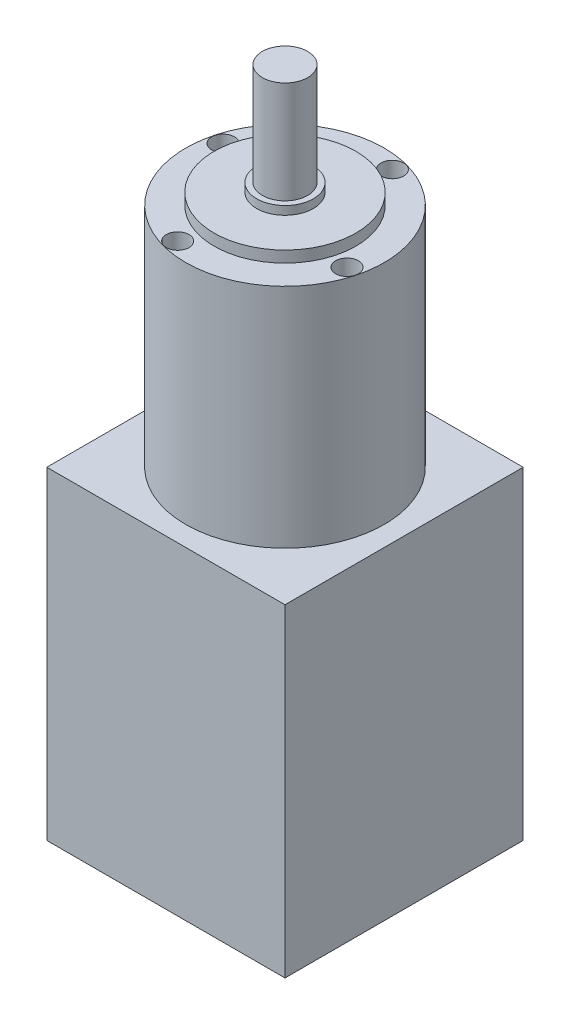
ISO-10303-21;
HEADER;
FILE_DESCRIPTION(('STEP AP214'),'2;1');
FILE_NAME('part.step','',(''),(''),'','','');
FILE_SCHEMA(('AUTOMOTIVE_DESIGN { 1 0 10303 214 1 1 1 1 }'));
ENDSEC;
DATA;
#1=APPLICATION_CONTEXT('core data for automotive mechanical design processes');
#2=APPLICATION_PROTOCOL_DEFINITION('international standard','automotive_design',2000,#1);
#3=PRODUCT_CONTEXT('',#1,'mechanical');
#4=PRODUCT('Part','Part','',(#3));
#5=PRODUCT_RELATED_PRODUCT_CATEGORY('part','',(#4));
#6=PRODUCT_DEFINITION_FORMATION('','',#4);
#7=PRODUCT_DEFINITION_CONTEXT('part definition',#1,'design');
#8=PRODUCT_DEFINITION('design','',#6,#7);
#9=PRODUCT_DEFINITION_SHAPE('','',#8);
#10=(LENGTH_UNIT() NAMED_UNIT(*) SI_UNIT(.MILLI.,.METRE.));
#11=(NAMED_UNIT(*) PLANE_ANGLE_UNIT() SI_UNIT($,.RADIAN.));
#12=(NAMED_UNIT(*) SI_UNIT($,.STERADIAN.) SOLID_ANGLE_UNIT());
#13=UNCERTAINTY_MEASURE_WITH_UNIT(LENGTH_MEASURE(1.E-05),#10,'distance_accuracy_value','');
#14=(GEOMETRIC_REPRESENTATION_CONTEXT(3) GLOBAL_UNCERTAINTY_ASSIGNED_CONTEXT((#13)) GLOBAL_UNIT_ASSIGNED_CONTEXT((#10,
#11,#12)) REPRESENTATION_CONTEXT('',''));
#15=CARTESIAN_POINT('',(0.,0.,0.));
#16=DIRECTION('',(0.,0.,1.));
#17=DIRECTION('',(1.,0.,0.));
#18=AXIS2_PLACEMENT_3D('',#15,#16,#17);
#19=CARTESIAN_POINT('',(21.,57.,21.));
#20=DIRECTION('',(-1.,0.,0.));
#21=DIRECTION('',(0.,0.,1.));
#22=AXIS2_PLACEMENT_3D('',#19,#20,#21);
#23=PLANE('',#22);
#24=DIRECTION('',(0.,0.,-1.));
#25=VECTOR('',#24,1.);
#26=CARTESIAN_POINT('',(21.,0.,21.));
#27=LINE('',#26,#25);
#28=CARTESIAN_POINT('',(21.,0.,21.));
#29=VERTEX_POINT('',#28);
#30=CARTESIAN_POINT('',(21.,0.,-21.));
#31=VERTEX_POINT('',#30);
#32=EDGE_CURVE('E98',#29,#31,#27,.T.);
#33=ORIENTED_EDGE('',*,*,#32,.T.);
#34=DIRECTION('',(0.,-1.,0.));
#35=VECTOR('',#34,1.);
#36=CARTESIAN_POINT('',(21.,57.,-21.));
#37=LINE('',#36,#35);
#38=CARTESIAN_POINT('',(21.,57.,-21.));
#39=VERTEX_POINT('',#38);
#40=EDGE_CURVE('E11',#39,#31,#37,.T.);
#41=ORIENTED_EDGE('',*,*,#40,.F.);
#42=DIRECTION('',(0.,0.,-1.));
#43=VECTOR('',#42,1.);
#44=CARTESIAN_POINT('',(21.,57.,21.));
#45=LINE('',#44,#43);
#46=CARTESIAN_POINT('',(21.,57.,21.));
#47=VERTEX_POINT('',#46);
#48=EDGE_CURVE('E86',#47,#39,#45,.T.);
#49=ORIENTED_EDGE('',*,*,#48,.F.);
#50=DIRECTION('',(0.,-1.,0.));
#51=VECTOR('',#50,1.);
#52=CARTESIAN_POINT('',(21.,57.,21.));
#53=LINE('',#52,#51);
#54=EDGE_CURVE('E94',#47,#29,#53,.T.);
#55=ORIENTED_EDGE('',*,*,#54,.T.);
#56=EDGE_LOOP('',(#33,#41,#49,#55));
#57=FACE_BOUND('',#56,.T.);
#58=ADVANCED_FACE('F35',(#57),#23,.F.);
#59=CARTESIAN_POINT('',(-21.,57.,-21.));
#60=DIRECTION('',(0.,0.,1.));
#61=DIRECTION('',(1.,0.,0.));
#62=AXIS2_PLACEMENT_3D('',#59,#60,#61);
#63=PLANE('',#62);
#64=DIRECTION('',(-1.,0.,0.));
#65=VECTOR('',#64,1.);
#66=CARTESIAN_POINT('',(-21.,0.,-21.));
#67=LINE('',#66,#65);
#68=CARTESIAN_POINT('',(-21.,0.,-21.));
#69=VERTEX_POINT('',#68);
#70=EDGE_CURVE('E90',#31,#69,#67,.T.);
#71=ORIENTED_EDGE('',*,*,#70,.T.);
#72=DIRECTION('',(0.,-1.,0.));
#73=VECTOR('',#72,1.);
#74=CARTESIAN_POINT('',(-21.,57.,-21.));
#75=LINE('',#74,#73);
#76=CARTESIAN_POINT('',(-21.,57.,-21.));
#77=VERTEX_POINT('',#76);
#78=EDGE_CURVE('E43',#77,#69,#75,.T.);
#79=ORIENTED_EDGE('',*,*,#78,.F.);
#80=DIRECTION('',(-1.,0.,0.));
#81=VECTOR('',#80,1.);
#82=CARTESIAN_POINT('',(-21.,57.,-21.));
#83=LINE('',#82,#81);
#84=EDGE_CURVE('E81',#39,#77,#83,.T.);
#85=ORIENTED_EDGE('',*,*,#84,.F.);
#86=ORIENTED_EDGE('',*,*,#40,.T.);
#87=EDGE_LOOP('',(#71,#79,#85,#86));
#88=FACE_BOUND('',#87,.T.);
#89=ADVANCED_FACE('F89',(#88),#63,.F.);
#90=CARTESIAN_POINT('',(-21.,57.,21.));
#91=DIRECTION('',(1.,0.,0.));
#92=DIRECTION('',(0.,0.,-1.));
#93=AXIS2_PLACEMENT_3D('',#90,#91,#92);
#94=PLANE('',#93);
#95=DIRECTION('',(0.,0.,1.));
#96=VECTOR('',#95,1.);
#97=CARTESIAN_POINT('',(-21.,0.,21.));
#98=LINE('',#97,#96);
#99=CARTESIAN_POINT('',(-21.,0.,21.));
#100=VERTEX_POINT('',#99);
#101=EDGE_CURVE('E68',#69,#100,#98,.T.);
#102=ORIENTED_EDGE('',*,*,#101,.T.);
#103=DIRECTION('',(0.,-1.,0.));
#104=VECTOR('',#103,1.);
#105=CARTESIAN_POINT('',(-21.,57.,21.));
#106=LINE('',#105,#104);
#107=CARTESIAN_POINT('',(-21.,57.,21.));
#108=VERTEX_POINT('',#107);
#109=EDGE_CURVE('E91',#108,#100,#106,.T.);
#110=ORIENTED_EDGE('',*,*,#109,.F.);
#111=DIRECTION('',(0.,0.,1.));
#112=VECTOR('',#111,1.);
#113=CARTESIAN_POINT('',(-21.,57.,21.));
#114=LINE('',#113,#112);
#115=EDGE_CURVE('E84',#77,#108,#114,.T.);
#116=ORIENTED_EDGE('',*,*,#115,.F.);
#117=ORIENTED_EDGE('',*,*,#78,.T.);
#118=EDGE_LOOP('',(#102,#110,#116,#117));
#119=FACE_BOUND('',#118,.T.);
#120=ADVANCED_FACE('F92',(#119),#94,.F.);
#121=CARTESIAN_POINT('',(-21.,57.,21.));
#122=DIRECTION('',(0.,0.,-1.));
#123=DIRECTION('',(-1.,0.,0.));
#124=AXIS2_PLACEMENT_3D('',#121,#122,#123);
#125=PLANE('',#124);
#126=DIRECTION('',(1.,0.,0.));
#127=VECTOR('',#126,1.);
#128=CARTESIAN_POINT('',(-21.,0.,21.));
#129=LINE('',#128,#127);
#130=EDGE_CURVE('E74',#100,#29,#129,.T.);
#131=ORIENTED_EDGE('',*,*,#130,.T.);
#132=ORIENTED_EDGE('',*,*,#54,.F.);
#133=DIRECTION('',(1.,0.,0.));
#134=VECTOR('',#133,1.);
#135=CARTESIAN_POINT('',(-21.,57.,21.));
#136=LINE('',#135,#134);
#137=EDGE_CURVE('E51',#108,#47,#136,.T.);
#138=ORIENTED_EDGE('',*,*,#137,.F.);
#139=ORIENTED_EDGE('',*,*,#109,.T.);
#140=EDGE_LOOP('',(#131,#132,#138,#139));
#141=FACE_BOUND('',#140,.T.);
#142=ADVANCED_FACE('F106',(#141),#125,.F.);
#143=CARTESIAN_POINT('',(0.,57.,0.));
#144=DIRECTION('',(0.,-1.,0.));
#145=DIRECTION('',(0.,0.,-1.));
#146=AXIS2_PLACEMENT_3D('',#143,#144,#145);
#147=PLANE('',#146);
#148=CARTESIAN_POINT('',(0.,57.,0.));
#149=DIRECTION('',(0.,-1.,0.));
#150=DIRECTION('',(0.,0.,-1.));
#151=AXIS2_PLACEMENT_3D('',#148,#149,#150);
#152=CIRCLE('',#151,17.5);
#153=CARTESIAN_POINT('',(0.,57.,-17.5));
#154=VERTEX_POINT('',#153);
#155=EDGE_CURVE('E112',#154,#154,#152,.T.);
#156=ORIENTED_EDGE('',*,*,#155,.T.);
#157=EDGE_LOOP('',(#156));
#158=FACE_BOUND('',#157,.T.);
#159=ORIENTED_EDGE('',*,*,#48,.T.);
#160=ORIENTED_EDGE('',*,*,#84,.T.);
#161=ORIENTED_EDGE('',*,*,#115,.T.);
#162=ORIENTED_EDGE('',*,*,#137,.T.);
#163=EDGE_LOOP('',(#159,#160,#161,#162));
#164=FACE_BOUND('',#163,.T.);
#165=ADVANCED_FACE('F82',(#158,#164),#147,.F.);
#166=CARTESIAN_POINT('',(0.,0.,0.));
#167=DIRECTION('',(0.,-1.,0.));
#168=DIRECTION('',(0.,0.,-1.));
#169=AXIS2_PLACEMENT_3D('',#166,#167,#168);
#170=PLANE('',#169);
#171=ORIENTED_EDGE('',*,*,#32,.F.);
#172=ORIENTED_EDGE('',*,*,#130,.F.);
#173=ORIENTED_EDGE('',*,*,#101,.F.);
#174=ORIENTED_EDGE('',*,*,#70,.F.);
#175=EDGE_LOOP('',(#171,#172,#173,#174));
#176=FACE_BOUND('',#175,.T.);
#177=ADVANCED_FACE('F109',(#176),#170,.T.);
#178=CARTESIAN_POINT('',(0.,97.,0.));
#179=DIRECTION('',(0.,-1.,0.));
#180=DIRECTION('',(0.,0.,-1.));
#181=AXIS2_PLACEMENT_3D('',#178,#179,#180);
#182=CYLINDRICAL_SURFACE('',#181,17.5);
#183=CARTESIAN_POINT('',(0.,97.,0.));
#184=DIRECTION('',(0.,-1.,0.));
#185=DIRECTION('',(0.,0.,-1.));
#186=AXIS2_PLACEMENT_3D('',#183,#184,#185);
#187=CIRCLE('',#186,17.5);
#188=CARTESIAN_POINT('',(0.,97.,-17.5));
#189=VERTEX_POINT('',#188);
#190=EDGE_CURVE('E101',#189,#189,#187,.T.);
#191=ORIENTED_EDGE('',*,*,#190,.T.);
#192=EDGE_LOOP('',(#191));
#193=FACE_BOUND('',#192,.T.);
#194=ORIENTED_EDGE('',*,*,#155,.F.);
#195=EDGE_LOOP('',(#194));
#196=FACE_BOUND('',#195,.T.);
#197=ADVANCED_FACE('F184',(#193,#196),#182,.T.);
#198=CARTESIAN_POINT('',(0.,97.,0.));
#199=DIRECTION('',(0.,-1.,0.));
#200=DIRECTION('',(0.,0.,-1.));
#201=AXIS2_PLACEMENT_3D('',#198,#199,#200);
#202=PLANE('',#201);
#203=CARTESIAN_POINT('',(3.99875424683385,97.,-14.9235540161661));
#204=DIRECTION('',(0.,-1.,0.));
#205=DIRECTION('',(0.,0.,-1.));
#206=AXIS2_PLACEMENT_3D('',#203,#204,#205);
#207=CIRCLE('',#206,2.);
#208=CARTESIAN_POINT('',(3.99875424683385,97.,-16.9235540161661));
#209=VERTEX_POINT('',#208);
#210=EDGE_CURVE('E154',#209,#209,#207,.T.);
#211=ORIENTED_EDGE('',*,*,#210,.T.);
#212=EDGE_LOOP('',(#211));
#213=FACE_BOUND('',#212,.T.);
#214=CARTESIAN_POINT('',(14.9235540161661,97.,3.99875424683386));
#215=DIRECTION('',(0.,-1.,0.));
#216=DIRECTION('',(0.,0.,-1.));
#217=AXIS2_PLACEMENT_3D('',#214,#215,#216);
#218=CIRCLE('',#217,2.00000000000001);
#219=CARTESIAN_POINT('',(14.9235540161661,97.,1.99875424683385));
#220=VERTEX_POINT('',#219);
#221=EDGE_CURVE('E148',#220,#220,#218,.T.);
#222=ORIENTED_EDGE('',*,*,#221,.T.);
#223=EDGE_LOOP('',(#222));
#224=FACE_BOUND('',#223,.T.);
#225=CARTESIAN_POINT('',(-3.99875424683385,97.,14.9235540161661));
#226=DIRECTION('',(0.,-1.,0.));
#227=DIRECTION('',(0.,0.,-1.));
#228=AXIS2_PLACEMENT_3D('',#225,#226,#227);
#229=CIRCLE('',#228,2.);
#230=CARTESIAN_POINT('',(-3.99875424683385,97.,12.9235540161661));
#231=VERTEX_POINT('',#230);
#232=EDGE_CURVE('E142',#231,#231,#229,.T.);
#233=ORIENTED_EDGE('',*,*,#232,.T.);
#234=EDGE_LOOP('',(#233));
#235=FACE_BOUND('',#234,.T.);
#236=CARTESIAN_POINT('',(-14.9235540161661,97.,-3.99875424683386));
#237=DIRECTION('',(0.,-1.,0.));
#238=DIRECTION('',(0.,0.,-1.));
#239=AXIS2_PLACEMENT_3D('',#236,#237,#238);
#240=CIRCLE('',#239,2.);
#241=CARTESIAN_POINT('',(-14.9235540161661,97.,-5.99875424683386));
#242=VERTEX_POINT('',#241);
#243=EDGE_CURVE('E136',#242,#242,#240,.T.);
#244=ORIENTED_EDGE('',*,*,#243,.T.);
#245=EDGE_LOOP('',(#244));
#246=FACE_BOUND('',#245,.T.);
#247=CARTESIAN_POINT('',(0.,97.,0.));
#248=DIRECTION('',(0.,-1.,0.));
#249=DIRECTION('',(0.,0.,-1.));
#250=AXIS2_PLACEMENT_3D('',#247,#248,#249);
#251=CIRCLE('',#250,12.5);
#252=CARTESIAN_POINT('',(0.,97.,-12.5));
#253=VERTEX_POINT('',#252);
#254=EDGE_CURVE('E118',#253,#253,#251,.T.);
#255=ORIENTED_EDGE('',*,*,#254,.T.);
#256=EDGE_LOOP('',(#255));
#257=FACE_BOUND('',#256,.T.);
#258=ORIENTED_EDGE('',*,*,#190,.F.);
#259=EDGE_LOOP('',(#258));
#260=FACE_BOUND('',#259,.T.);
#261=ADVANCED_FACE('F190',(#213,#224,#235,#246,#257,#260),#202,.F.);
#262=CARTESIAN_POINT('',(0.,99.,0.));
#263=DIRECTION('',(0.,-1.,0.));
#264=DIRECTION('',(0.,0.,-1.));
#265=AXIS2_PLACEMENT_3D('',#262,#263,#264);
#266=CYLINDRICAL_SURFACE('',#265,12.5);
#267=CARTESIAN_POINT('',(0.,99.,0.));
#268=DIRECTION('',(0.,-1.,0.));
#269=DIRECTION('',(0.,0.,-1.));
#270=AXIS2_PLACEMENT_3D('',#267,#268,#269);
#271=CIRCLE('',#270,12.5);
#272=CARTESIAN_POINT('',(0.,99.,-12.5));
#273=VERTEX_POINT('',#272);
#274=EDGE_CURVE('E115',#273,#273,#271,.T.);
#275=ORIENTED_EDGE('',*,*,#274,.T.);
#276=EDGE_LOOP('',(#275));
#277=FACE_BOUND('',#276,.T.);
#278=ORIENTED_EDGE('',*,*,#254,.F.);
#279=EDGE_LOOP('',(#278));
#280=FACE_BOUND('',#279,.T.);
#281=ADVANCED_FACE('F194',(#277,#280),#266,.T.);
#282=CARTESIAN_POINT('',(0.,99.,0.));
#283=DIRECTION('',(0.,-1.,0.));
#284=DIRECTION('',(0.,0.,-1.));
#285=AXIS2_PLACEMENT_3D('',#282,#283,#284);
#286=PLANE('',#285);
#287=CARTESIAN_POINT('',(0.,99.,0.));
#288=DIRECTION('',(0.,-1.,0.));
#289=DIRECTION('',(0.,0.,-1.));
#290=AXIS2_PLACEMENT_3D('',#287,#288,#289);
#291=CIRCLE('',#290,5.);
#292=CARTESIAN_POINT('',(0.,99.,-5.));
#293=VERTEX_POINT('',#292);
#294=EDGE_CURVE('E124',#293,#293,#291,.T.);
#295=ORIENTED_EDGE('',*,*,#294,.T.);
#296=EDGE_LOOP('',(#295));
#297=FACE_BOUND('',#296,.T.);
#298=ORIENTED_EDGE('',*,*,#274,.F.);
#299=EDGE_LOOP('',(#298));
#300=FACE_BOUND('',#299,.T.);
#301=ADVANCED_FACE('F198',(#297,#300),#286,.F.);
#302=CARTESIAN_POINT('',(0.,100.5,0.));
#303=DIRECTION('',(0.,-1.,0.));
#304=DIRECTION('',(0.,0.,-1.));
#305=AXIS2_PLACEMENT_3D('',#302,#303,#304);
#306=CYLINDRICAL_SURFACE('',#305,5.);
#307=CARTESIAN_POINT('',(0.,100.5,0.));
#308=DIRECTION('',(0.,-1.,0.));
#309=DIRECTION('',(0.,0.,-1.));
#310=AXIS2_PLACEMENT_3D('',#307,#308,#309);
#311=CIRCLE('',#310,5.);
#312=CARTESIAN_POINT('',(0.,100.5,-5.));
#313=VERTEX_POINT('',#312);
#314=EDGE_CURVE('E121',#313,#313,#311,.T.);
#315=ORIENTED_EDGE('',*,*,#314,.T.);
#316=EDGE_LOOP('',(#315));
#317=FACE_BOUND('',#316,.T.);
#318=ORIENTED_EDGE('',*,*,#294,.F.);
#319=EDGE_LOOP('',(#318));
#320=FACE_BOUND('',#319,.T.);
#321=ADVANCED_FACE('F202',(#317,#320),#306,.T.);
#322=CARTESIAN_POINT('',(0.,100.5,0.));
#323=DIRECTION('',(0.,-1.,0.));
#324=DIRECTION('',(0.,0.,-1.));
#325=AXIS2_PLACEMENT_3D('',#322,#323,#324);
#326=PLANE('',#325);
#327=CARTESIAN_POINT('',(0.,100.5,0.));
#328=DIRECTION('',(0.,-1.,0.));
#329=DIRECTION('',(0.,0.,-1.));
#330=AXIS2_PLACEMENT_3D('',#327,#328,#329);
#331=CIRCLE('',#330,4.);
#332=CARTESIAN_POINT('',(0.,100.5,-4.));
#333=VERTEX_POINT('',#332);
#334=EDGE_CURVE('E130',#333,#333,#331,.T.);
#335=ORIENTED_EDGE('',*,*,#334,.T.);
#336=EDGE_LOOP('',(#335));
#337=FACE_BOUND('',#336,.T.);
#338=ORIENTED_EDGE('',*,*,#314,.F.);
#339=EDGE_LOOP('',(#338));
#340=FACE_BOUND('',#339,.T.);
#341=ADVANCED_FACE('F206',(#337,#340),#326,.F.);
#342=CARTESIAN_POINT('',(0.,118.5,0.));
#343=DIRECTION('',(0.,-1.,0.));
#344=DIRECTION('',(0.,0.,-1.));
#345=AXIS2_PLACEMENT_3D('',#342,#343,#344);
#346=CYLINDRICAL_SURFACE('',#345,4.);
#347=CARTESIAN_POINT('',(0.,118.5,0.));
#348=DIRECTION('',(0.,-1.,0.));
#349=DIRECTION('',(0.,0.,-1.));
#350=AXIS2_PLACEMENT_3D('',#347,#348,#349);
#351=CIRCLE('',#350,4.);
#352=CARTESIAN_POINT('',(0.,118.5,-4.));
#353=VERTEX_POINT('',#352);
#354=EDGE_CURVE('E127',#353,#353,#351,.T.);
#355=ORIENTED_EDGE('',*,*,#354,.T.);
#356=EDGE_LOOP('',(#355));
#357=FACE_BOUND('',#356,.T.);
#358=ORIENTED_EDGE('',*,*,#334,.F.);
#359=EDGE_LOOP('',(#358));
#360=FACE_BOUND('',#359,.T.);
#361=ADVANCED_FACE('F210',(#357,#360),#346,.T.);
#362=CARTESIAN_POINT('',(0.,118.5,0.));
#363=DIRECTION('',(0.,-1.,0.));
#364=DIRECTION('',(0.,0.,-1.));
#365=AXIS2_PLACEMENT_3D('',#362,#363,#364);
#366=PLANE('',#365);
#367=ORIENTED_EDGE('',*,*,#354,.F.);
#368=EDGE_LOOP('',(#367));
#369=FACE_BOUND('',#368,.T.);
#370=ADVANCED_FACE('F214',(#369),#366,.F.);
#371=CARTESIAN_POINT('',(-14.9235540161661,82.,-3.99875424683386));
#372=DIRECTION('',(0.,1.,0.));
#373=DIRECTION('',(0.,0.,1.));
#374=AXIS2_PLACEMENT_3D('',#371,#372,#373);
#375=CYLINDRICAL_SURFACE('',#374,2.);
#376=CARTESIAN_POINT('',(-14.9235540161661,82.,-3.99875424683386));
#377=DIRECTION('',(0.,-1.,0.));
#378=DIRECTION('',(0.,0.,-1.));
#379=AXIS2_PLACEMENT_3D('',#376,#377,#378);
#380=CIRCLE('',#379,2.);
#381=CARTESIAN_POINT('',(-14.9235540161661,82.,-5.99875424683386));
#382=VERTEX_POINT('',#381);
#383=EDGE_CURVE('E139',#382,#382,#380,.T.);
#384=ORIENTED_EDGE('',*,*,#383,.T.);
#385=EDGE_LOOP('',(#384));
#386=FACE_BOUND('',#385,.T.);
#387=ORIENTED_EDGE('',*,*,#243,.F.);
#388=EDGE_LOOP('',(#387));
#389=FACE_BOUND('',#388,.T.);
#390=ADVANCED_FACE('F218',(#386,#389),#375,.F.);
#391=CARTESIAN_POINT('',(-14.9235540161661,82.,-3.99875424683386));
#392=DIRECTION('',(0.,-1.,0.));
#393=DIRECTION('',(0.,0.,-1.));
#394=AXIS2_PLACEMENT_3D('',#391,#392,#393);
#395=PLANE('',#394);
#396=ORIENTED_EDGE('',*,*,#383,.F.);
#397=EDGE_LOOP('',(#396));
#398=FACE_BOUND('',#397,.T.);
#399=ADVANCED_FACE('F222',(#398),#395,.F.);
#400=CARTESIAN_POINT('',(-3.99875424683385,82.,14.9235540161661));
#401=DIRECTION('',(0.,1.,0.));
#402=DIRECTION('',(0.,0.,1.));
#403=AXIS2_PLACEMENT_3D('',#400,#401,#402);
#404=CYLINDRICAL_SURFACE('',#403,2.);
#405=CARTESIAN_POINT('',(-3.99875424683385,82.,14.9235540161661));
#406=DIRECTION('',(0.,-1.,0.));
#407=DIRECTION('',(0.,0.,-1.));
#408=AXIS2_PLACEMENT_3D('',#405,#406,#407);
#409=CIRCLE('',#408,2.);
#410=CARTESIAN_POINT('',(-3.99875424683385,82.,12.9235540161661));
#411=VERTEX_POINT('',#410);
#412=EDGE_CURVE('E145',#411,#411,#409,.T.);
#413=ORIENTED_EDGE('',*,*,#412,.T.);
#414=EDGE_LOOP('',(#413));
#415=FACE_BOUND('',#414,.T.);
#416=ORIENTED_EDGE('',*,*,#232,.F.);
#417=EDGE_LOOP('',(#416));
#418=FACE_BOUND('',#417,.T.);
#419=ADVANCED_FACE('F226',(#415,#418),#404,.F.);
#420=CARTESIAN_POINT('',(-3.99875424683385,82.,14.9235540161661));
#421=DIRECTION('',(0.,-1.,0.));
#422=DIRECTION('',(0.,0.,-1.));
#423=AXIS2_PLACEMENT_3D('',#420,#421,#422);
#424=PLANE('',#423);
#425=ORIENTED_EDGE('',*,*,#412,.F.);
#426=EDGE_LOOP('',(#425));
#427=FACE_BOUND('',#426,.T.);
#428=ADVANCED_FACE('F230',(#427),#424,.F.);
#429=CARTESIAN_POINT('',(14.9235540161661,82.,3.99875424683386));
#430=DIRECTION('',(0.,1.,0.));
#431=DIRECTION('',(0.,0.,1.));
#432=AXIS2_PLACEMENT_3D('',#429,#430,#431);
#433=CYLINDRICAL_SURFACE('',#432,2.00000000000001);
#434=CARTESIAN_POINT('',(14.9235540161661,82.,3.99875424683386));
#435=DIRECTION('',(0.,-1.,0.));
#436=DIRECTION('',(0.,0.,-1.));
#437=AXIS2_PLACEMENT_3D('',#434,#435,#436);
#438=CIRCLE('',#437,2.00000000000001);
#439=CARTESIAN_POINT('',(14.9235540161661,82.,1.99875424683385));
#440=VERTEX_POINT('',#439);
#441=EDGE_CURVE('E151',#440,#440,#438,.T.);
#442=ORIENTED_EDGE('',*,*,#441,.T.);
#443=EDGE_LOOP('',(#442));
#444=FACE_BOUND('',#443,.T.);
#445=ORIENTED_EDGE('',*,*,#221,.F.);
#446=EDGE_LOOP('',(#445));
#447=FACE_BOUND('',#446,.T.);
#448=ADVANCED_FACE('F234',(#444,#447),#433,.F.);
#449=CARTESIAN_POINT('',(14.9235540161661,82.,3.99875424683386));
#450=DIRECTION('',(0.,-1.,0.));
#451=DIRECTION('',(0.,0.,-1.));
#452=AXIS2_PLACEMENT_3D('',#449,#450,#451);
#453=PLANE('',#452);
#454=ORIENTED_EDGE('',*,*,#441,.F.);
#455=EDGE_LOOP('',(#454));
#456=FACE_BOUND('',#455,.T.);
#457=ADVANCED_FACE('F169',(#456),#453,.F.);
#458=CARTESIAN_POINT('',(3.99875424683385,82.,-14.9235540161661));
#459=DIRECTION('',(0.,1.,0.));
#460=DIRECTION('',(0.,0.,1.));
#461=AXIS2_PLACEMENT_3D('',#458,#459,#460);
#462=CYLINDRICAL_SURFACE('',#461,2.);
#463=CARTESIAN_POINT('',(3.99875424683385,82.,-14.9235540161661));
#464=DIRECTION('',(0.,-1.,0.));
#465=DIRECTION('',(0.,0.,-1.));
#466=AXIS2_PLACEMENT_3D('',#463,#464,#465);
#467=CIRCLE('',#466,2.);
#468=CARTESIAN_POINT('',(3.99875424683385,82.,-16.9235540161661));
#469=VERTEX_POINT('',#468);
#470=EDGE_CURVE('E133',#469,#469,#467,.T.);
#471=ORIENTED_EDGE('',*,*,#470,.T.);
#472=EDGE_LOOP('',(#471));
#473=FACE_BOUND('',#472,.T.);
#474=ORIENTED_EDGE('',*,*,#210,.F.);
#475=EDGE_LOOP('',(#474));
#476=FACE_BOUND('',#475,.T.);
#477=ADVANCED_FACE('F160',(#473,#476),#462,.F.);
#478=CARTESIAN_POINT('',(3.99875424683385,82.,-14.9235540161661));
#479=DIRECTION('',(0.,-1.,0.));
#480=DIRECTION('',(0.,0.,-1.));
#481=AXIS2_PLACEMENT_3D('',#478,#479,#480);
#482=PLANE('',#481);
#483=ORIENTED_EDGE('',*,*,#470,.F.);
#484=EDGE_LOOP('',(#483));
#485=FACE_BOUND('',#484,.T.);
#486=ADVANCED_FACE('F163',(#485),#482,.F.);
#487=CLOSED_SHELL('',(#58,#89,#120,#142,#165,#177,#197,#261,#281,#301,#321,#341,#361,#370,#390,
#399,#419,#428,#448,#457,#477,#486));
#488=MANIFOLD_SOLID_BREP('B2',#487);
#489=ADVANCED_BREP_SHAPE_REPRESENTATION('',(#18,#488),#14);
#490=SHAPE_DEFINITION_REPRESENTATION(#9,#489);
ENDSEC;
END-ISO-10303-21;
